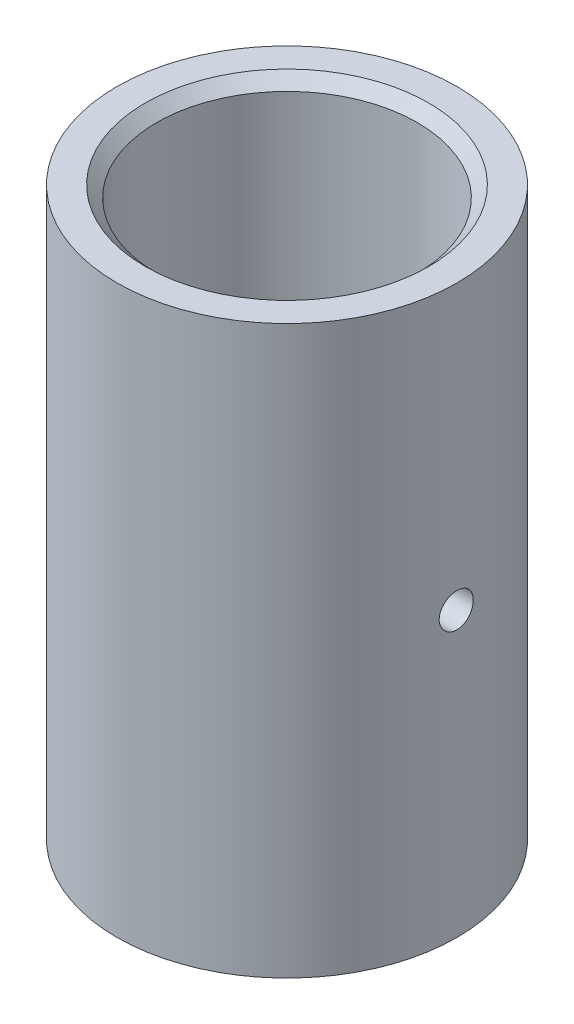
ISO-10303-21;
HEADER;
FILE_DESCRIPTION(('STEP AP214'),'2;1');
FILE_NAME('part.step','',(''),(''),'','','');
FILE_SCHEMA(('AUTOMOTIVE_DESIGN { 1 0 10303 214 1 1 1 1 }'));
ENDSEC;
DATA;
#1=APPLICATION_CONTEXT('core data for automotive mechanical design processes');
#2=APPLICATION_PROTOCOL_DEFINITION('international standard','automotive_design',2000,#1);
#3=PRODUCT_CONTEXT('',#1,'mechanical');
#4=PRODUCT('Part','Part','',(#3));
#5=PRODUCT_RELATED_PRODUCT_CATEGORY('part','',(#4));
#6=PRODUCT_DEFINITION_FORMATION('','',#4);
#7=PRODUCT_DEFINITION_CONTEXT('part definition',#1,'design');
#8=PRODUCT_DEFINITION('design','',#6,#7);
#9=PRODUCT_DEFINITION_SHAPE('','',#8);
#10=(LENGTH_UNIT() NAMED_UNIT(*) SI_UNIT(.MILLI.,.METRE.));
#11=(NAMED_UNIT(*) PLANE_ANGLE_UNIT() SI_UNIT($,.RADIAN.));
#12=(NAMED_UNIT(*) SI_UNIT($,.STERADIAN.) SOLID_ANGLE_UNIT());
#13=UNCERTAINTY_MEASURE_WITH_UNIT(LENGTH_MEASURE(1.E-05),#10,'distance_accuracy_value','');
#14=(GEOMETRIC_REPRESENTATION_CONTEXT(3) GLOBAL_UNCERTAINTY_ASSIGNED_CONTEXT((#13)) GLOBAL_UNIT_ASSIGNED_CONTEXT((#10,
#11,#12)) REPRESENTATION_CONTEXT('',''));
#15=CARTESIAN_POINT('',(0.,0.,0.));
#16=DIRECTION('',(0.,0.,1.));
#17=DIRECTION('',(1.,0.,0.));
#18=AXIS2_PLACEMENT_3D('',#15,#16,#17);
#19=CARTESIAN_POINT('',(0.,25.,0.));
#20=DIRECTION('',(0.,-1.,0.));
#21=DIRECTION('',(0.,0.,-1.));
#22=AXIS2_PLACEMENT_3D('',#19,#20,#21);
#23=CYLINDRICAL_SURFACE('',#22,7.5);
#24=CARTESIAN_POINT('',(-7.46240577829965,12.5,-0.75));
#25=CARTESIAN_POINT('',(-7.46240627097677,12.4579853268698,-0.749998180045134));
#26=CARTESIAN_POINT('',(-7.46276442745664,12.4159428736911,-0.746457644236857));
#27=CARTESIAN_POINT('',(-7.46415815668589,12.3330236102798,-0.732387236072671));
#28=CARTESIAN_POINT('',(-7.46519447595914,12.2921481364719,-0.721849661164827));
#29=CARTESIAN_POINT('',(-7.4678259978554,12.2127756355866,-0.694095087051695));
#30=CARTESIAN_POINT('',(-7.46942086160092,12.1742771829564,-0.676882137220424));
#31=CARTESIAN_POINT('',(-7.47298935428865,12.1007241557812,-0.636273200543326));
#32=CARTESIAN_POINT('',(-7.47496290798247,12.0656688991372,-0.612878441719444));
#33=CARTESIAN_POINT('',(-7.47907445032424,11.9998615522569,-0.560478571499028));
#34=CARTESIAN_POINT('',(-7.4812129500395,11.9691237428722,-0.531455563581194));
#35=CARTESIAN_POINT('',(-7.48540878926789,11.9129467932473,-0.468661286489673));
#36=CARTESIAN_POINT('',(-7.4874661250641,11.8875078954453,-0.434889800179926));
#37=CARTESIAN_POINT('',(-7.49127287366704,11.8426015572446,-0.363469771238241));
#38=CARTESIAN_POINT('',(-7.49302163170985,11.8231467509048,-0.325813246897177));
#39=CARTESIAN_POINT('',(-7.49600862656828,11.7908416751385,-0.247747488215632));
#40=CARTESIAN_POINT('',(-7.49724687582798,11.7779912447229,-0.207338321001163));
#41=CARTESIAN_POINT('',(-7.49906974928269,11.7593015679851,-0.125058587057212));
#42=CARTESIAN_POINT('',(-7.49965655882113,11.7534388754375,-0.0831933952736856));
#43=CARTESIAN_POINT('',(-7.50011786699019,11.7488185481497,0.000930555516707348));
#44=CARTESIAN_POINT('',(-7.49999238408954,11.7500607291903,0.0431893042908458));
#45=CARTESIAN_POINT('',(-7.49904503483389,11.7595958544876,0.12674163304842));
#46=CARTESIAN_POINT('',(-7.49822565863784,11.7678635866729,0.168038122451234));
#47=CARTESIAN_POINT('',(-7.49598546948698,11.79117584671,0.2486543846284));
#48=CARTESIAN_POINT('',(-7.49456464871965,11.8062204625907,0.287974131718296));
#49=CARTESIAN_POINT('',(-7.49127703112937,11.8426870724408,0.36360023600969));
#50=CARTESIAN_POINT('',(-7.48940945524318,11.8641202231476,0.399901178236238));
#51=CARTESIAN_POINT('',(-7.48543788389556,11.9127473925023,0.468400134880646));
#52=CARTESIAN_POINT('',(-7.48333388150108,11.9399415801089,0.500598028920621));
#53=CARTESIAN_POINT('',(-7.47911470100888,11.9994606721352,0.560124578867017));
#54=CARTESIAN_POINT('',(-7.47699951429771,12.0318075085562,0.587431309642758));
#55=CARTESIAN_POINT('',(-7.47300554946167,12.1006376489081,0.636230651518438));
#56=CARTESIAN_POINT('',(-7.47112677167973,12.1371209588391,0.657723254184667));
#57=CARTESIAN_POINT('',(-7.46781817135612,12.2132052688998,0.694284138429923));
#58=CARTESIAN_POINT('',(-7.46638844349416,12.2528069243172,0.70935106542972));
#59=CARTESIAN_POINT('',(-7.46414176403203,12.333995453461,0.732615551728192));
#60=CARTESIAN_POINT('',(-7.46332479376326,12.3755822666656,0.740813320307275));
#61=CARTESIAN_POINT('',(-7.46239935395563,12.4593681346471,0.75007858154397));
#62=CARTESIAN_POINT('',(-7.46228783660702,12.5015637651986,0.751176747485409));
#63=CARTESIAN_POINT('',(-7.46277788516079,12.5855384493671,0.746292185153522));
#64=CARTESIAN_POINT('',(-7.46337944142796,12.6273175086053,0.740309552557316));
#65=CARTESIAN_POINT('',(-7.46522508316801,12.7091836867088,0.72145888088064));
#66=CARTESIAN_POINT('',(-7.46646781501009,12.749274178321,0.708605345391682));
#67=CARTESIAN_POINT('',(-7.46945468279096,12.8267300387977,0.676392539756955));
#68=CARTESIAN_POINT('',(-7.47119883021502,12.8640953452154,0.657033120587692));
#69=CARTESIAN_POINT('',(-7.47499938266785,12.9351799805216,0.612281251067414));
#70=CARTESIAN_POINT('',(-7.47705683111004,12.9688864564747,0.586868474880519));
#71=CARTESIAN_POINT('',(-7.4812487446889,13.0315662899556,0.530760400088381));
#72=CARTESIAN_POINT('',(-7.48338321173149,13.0605395302551,0.500064970686101));
#73=CARTESIAN_POINT('',(-7.48749785886976,13.1130362250486,0.434129853169856));
#74=CARTESIAN_POINT('',(-7.48947745541606,13.1365396696897,0.39887419197709));
#75=CARTESIAN_POINT('',(-7.49305081579973,13.1772919013798,0.324898288062849));
#76=CARTESIAN_POINT('',(-7.49464458492369,13.1945407741303,0.28617809282222));
#77=CARTESIAN_POINT('',(-7.49726407810504,13.2222603257415,0.206442094824612));
#78=CARTESIAN_POINT('',(-7.49829081454236,13.2327430904939,0.16543052823747));
#79=CARTESIAN_POINT('',(-7.49966470960237,13.2466723021849,0.0822186104877594));
#80=CARTESIAN_POINT('',(-7.50001188732422,13.2501189468755,0.0400182927691633));
#81=CARTESIAN_POINT('',(-7.49998753734952,13.24987530017,-0.0441766680568097));
#82=CARTESIAN_POINT('',(-7.49961913782502,13.2462160723725,-0.0861714054183956));
#83=CARTESIAN_POINT('',(-7.49821120183193,13.2319296907573,-0.168946416267272));
#84=CARTESIAN_POINT('',(-7.49717166483655,13.2213025314703,-0.209726688801274));
#85=CARTESIAN_POINT('',(-7.49453792860471,13.1933905569553,-0.288914931575808));
#86=CARTESIAN_POINT('',(-7.49294380502437,13.1761066497994,-0.327323224558146));
#87=CARTESIAN_POINT('',(-7.48937859312222,13.1353751233123,-0.400698450116097));
#88=CARTESIAN_POINT('',(-7.48740750700616,13.1119275400467,-0.435665402826419));
#89=CARTESIAN_POINT('',(-7.48329888501791,13.0594177857322,-0.501324543320204));
#90=CARTESIAN_POINT('',(-7.48116068595524,13.0303324878164,-0.531998194664506));
#91=CARTESIAN_POINT('',(-7.47696443077244,12.9674184863409,-0.588043319544858));
#92=CARTESIAN_POINT('',(-7.47490639400833,12.9335886461232,-0.613413518885886));
#93=CARTESIAN_POINT('',(-7.47109787557951,12.8620517435601,-0.65818248031804));
#94=CARTESIAN_POINT('',(-7.4693481894398,12.824335039007,-0.677565890996126));
#95=CARTESIAN_POINT('',(-7.46636396071846,12.7461887815653,-0.709698531074077));
#96=CARTESIAN_POINT('',(-7.46512883740019,12.7057623470557,-0.722455243417394));
#97=CARTESIAN_POINT('',(-7.46362505653609,12.6375891943257,-0.737791266250147));
#98=CARTESIAN_POINT('',(-7.4631699895177,12.6102783115202,-0.742363284298669));
#99=CARTESIAN_POINT('',(-7.46256018883247,12.5553156327181,-0.748468243953835));
#100=CARTESIAN_POINT('',(-7.46240545390488,12.5276638381531,-0.750001198317948));
#101=CARTESIAN_POINT('',(-7.46240577829965,12.5,-0.75));
#102=B_SPLINE_CURVE_WITH_KNOTS('',3,(#24,#25,#26,#27,#28,#29,#30,#31,#32,#33,#34,#35,#36,#37,
#38,#39,#40,#41,#42,#43,#44,#45,#46,#47,#48,#49,#50,#51,#52,#53,#54,#55,#56,#57,#58,#59,#60,#61,
#62,#63,#64,#65,#66,#67,#68,#69,#70,#71,#72,#73,#74,#75,#76,#77,#78,#79,#80,#81,#82,#83,#84,#85,
#86,#87,#88,#89,#90,#91,#92,#93,#94,#95,#96,#97,#98,#99,#100,#101),.UNSPECIFIED.,.T.,.F.,(4,2,2,
2,2,2,2,2,2,2,2,2,2,2,2,2,2,2,2,2,2,2,2,2,2,2,2,2,2,2,2,2,2,2,2,2,2,2,4),(0.,0.125942995827347,
0.252024863866327,0.378030368248105,0.504010860315985,0.630398711474438,0.756792343914397,
0.883451024784688,1.01010661805846,1.13633603173837,1.26256217248674,1.38833723863996,
1.51411393860731,1.6401115909981,1.76611293913897,1.89266568813751,2.01921862070672,
2.1457982183845,2.27237395946275,2.39840247230824,2.52442928225153,2.65019111028395,
2.77595581920785,2.90214892358789,3.02834515292402,3.15499602613589,3.28164516388504,
3.40806744520771,3.53448617334862,3.66035350101362,3.78622092747494,3.91207118996435,
4.03792071608099,4.16429786278491,4.29070533775894,4.41743430802857,4.54401986170501,
4.62694520704535,4.70987020427861),.UNSPECIFIED.);
#103=CARTESIAN_POINT('',(-7.46240577829965,12.5,-0.75));
#104=VERTEX_POINT('',#103);
#105=EDGE_CURVE('E106',#104,#104,#102,.T.);
#106=ORIENTED_EDGE('',*,*,#105,.F.);
#107=EDGE_LOOP('',(#106));
#108=FACE_BOUND('',#107,.T.);
#109=CARTESIAN_POINT('',(0.,0.,0.));
#110=DIRECTION('',(0.,1.,0.));
#111=DIRECTION('',(0.,0.,1.));
#112=AXIS2_PLACEMENT_3D('',#109,#110,#111);
#113=CIRCLE('',#112,7.5);
#114=CARTESIAN_POINT('',(0.,0.,7.5));
#115=VERTEX_POINT('',#114);
#116=EDGE_CURVE('E59',#115,#115,#113,.T.);
#117=ORIENTED_EDGE('',*,*,#116,.T.);
#118=EDGE_LOOP('',(#117));
#119=FACE_BOUND('',#118,.T.);
#120=CARTESIAN_POINT('',(0.,25.,0.));
#121=DIRECTION('',(0.,1.,0.));
#122=DIRECTION('',(0.,0.,1.));
#123=AXIS2_PLACEMENT_3D('',#120,#121,#122);
#124=CIRCLE('',#123,7.5);
#125=CARTESIAN_POINT('',(0.,25.,7.5));
#126=VERTEX_POINT('',#125);
#127=EDGE_CURVE('E55',#126,#126,#124,.T.);
#128=ORIENTED_EDGE('',*,*,#127,.F.);
#129=EDGE_LOOP('',(#128));
#130=FACE_BOUND('',#129,.T.);
#131=CARTESIAN_POINT('',(7.46240577829965,12.5,0.75));
#132=CARTESIAN_POINT('',(7.46240627097677,12.5420146731302,0.749998180045134));
#133=CARTESIAN_POINT('',(7.46276442745664,12.5840571263089,0.746457644236856));
#134=CARTESIAN_POINT('',(7.46415815668589,12.6669763897202,0.732387236072671));
#135=CARTESIAN_POINT('',(7.46519447595914,12.7078518635281,0.721849661164827));
#136=CARTESIAN_POINT('',(7.4678259978554,12.7872243644134,0.694095087051695));
#137=CARTESIAN_POINT('',(7.46942086160092,12.8257228170436,0.676882137220424));
#138=CARTESIAN_POINT('',(7.47298935428865,12.8992758442188,0.636273200543326));
#139=CARTESIAN_POINT('',(7.47496290798247,12.9343311008628,0.612878441719444));
#140=CARTESIAN_POINT('',(7.47907445032424,13.0001384477431,0.560478571499028));
#141=CARTESIAN_POINT('',(7.4812129500395,13.0308762571278,0.531455563581194));
#142=CARTESIAN_POINT('',(7.48540878926789,13.0870532067527,0.468661286489673));
#143=CARTESIAN_POINT('',(7.4874661250641,13.1124921045547,0.434889800179927));
#144=CARTESIAN_POINT('',(7.49127287366704,13.1573984427554,0.363469771238241));
#145=CARTESIAN_POINT('',(7.49302163170985,13.1768532490952,0.325813246897177));
#146=CARTESIAN_POINT('',(7.49600862656828,13.2091583248615,0.247747488215633));
#147=CARTESIAN_POINT('',(7.49724687582798,13.2220087552771,0.207338321001164));
#148=CARTESIAN_POINT('',(7.49906974928269,13.2406984320149,0.125058587057212));
#149=CARTESIAN_POINT('',(7.49965655882113,13.2465611245625,0.0831933952736857));
#150=CARTESIAN_POINT('',(7.50011786699019,13.2511814518503,-0.000930555516707375));
#151=CARTESIAN_POINT('',(7.49999238408954,13.2499392708097,-0.0431893042908458));
#152=CARTESIAN_POINT('',(7.49904503483389,13.2404041455124,-0.12674163304842));
#153=CARTESIAN_POINT('',(7.49822565863784,13.2321364133271,-0.168038122451234));
#154=CARTESIAN_POINT('',(7.49598546948698,13.20882415329,-0.2486543846284));
#155=CARTESIAN_POINT('',(7.49456464871965,13.1937795374093,-0.287974131718296));
#156=CARTESIAN_POINT('',(7.49127703112937,13.1573129275592,-0.36360023600969));
#157=CARTESIAN_POINT('',(7.48940945524318,13.1358797768524,-0.399901178236238));
#158=CARTESIAN_POINT('',(7.48543788389556,13.0872526074977,-0.468400134880646));
#159=CARTESIAN_POINT('',(7.48333388150108,13.0600584198911,-0.500598028920621));
#160=CARTESIAN_POINT('',(7.47911470100888,13.0005393278648,-0.560124578867017));
#161=CARTESIAN_POINT('',(7.47699951429771,12.9681924914438,-0.587431309642758));
#162=CARTESIAN_POINT('',(7.47300554946167,12.8993623510919,-0.636230651518438));
#163=CARTESIAN_POINT('',(7.47112677167973,12.8628790411609,-0.657723254184667));
#164=CARTESIAN_POINT('',(7.46781817135612,12.7867947311002,-0.694284138429923));
#165=CARTESIAN_POINT('',(7.46638844349416,12.7471930756828,-0.70935106542972));
#166=CARTESIAN_POINT('',(7.46414176403203,12.666004546539,-0.732615551728192));
#167=CARTESIAN_POINT('',(7.46332479376326,12.6244177333344,-0.740813320307275));
#168=CARTESIAN_POINT('',(7.46239935395563,12.5406318653529,-0.75007858154397));
#169=CARTESIAN_POINT('',(7.46228783660702,12.4984362348014,-0.751176747485409));
#170=CARTESIAN_POINT('',(7.46277788516079,12.4144615506329,-0.746292185153522));
#171=CARTESIAN_POINT('',(7.46337944142796,12.3726824913947,-0.740309552557316));
#172=CARTESIAN_POINT('',(7.46522508316801,12.2908163132912,-0.72145888088064));
#173=CARTESIAN_POINT('',(7.46646781501009,12.250725821679,-0.708605345391682));
#174=CARTESIAN_POINT('',(7.46945468279096,12.1732699612023,-0.676392539756955));
#175=CARTESIAN_POINT('',(7.47119883021502,12.1359046547846,-0.657033120587692));
#176=CARTESIAN_POINT('',(7.47499938266785,12.0648200194784,-0.612281251067414));
#177=CARTESIAN_POINT('',(7.47705683111004,12.0311135435253,-0.586868474880519));
#178=CARTESIAN_POINT('',(7.4812487446889,11.9684337100445,-0.530760400088381));
#179=CARTESIAN_POINT('',(7.48338321173149,11.9394604697449,-0.500064970686101));
#180=CARTESIAN_POINT('',(7.48749785886976,11.8869637749514,-0.434129853169856));
#181=CARTESIAN_POINT('',(7.48947745541606,11.8634603303103,-0.39887419197709));
#182=CARTESIAN_POINT('',(7.49305081579973,11.8227080986202,-0.32489828806285));
#183=CARTESIAN_POINT('',(7.49464458492369,11.8054592258697,-0.28617809282222));
#184=CARTESIAN_POINT('',(7.49726407810504,11.7777396742585,-0.206442094824612));
#185=CARTESIAN_POINT('',(7.49829081454236,11.7672569095061,-0.16543052823747));
#186=CARTESIAN_POINT('',(7.49966470960237,11.7533276978151,-0.0822186104877594));
#187=CARTESIAN_POINT('',(7.50001188732422,11.7498810531245,-0.0400182927691633));
#188=CARTESIAN_POINT('',(7.49998753734952,11.75012469983,0.0441766680568097));
#189=CARTESIAN_POINT('',(7.49961913782502,11.7537839276275,0.0861714054183956));
#190=CARTESIAN_POINT('',(7.49821120183193,11.7680703092427,0.168946416267272));
#191=CARTESIAN_POINT('',(7.49717166483655,11.7786974685297,0.209726688801274));
#192=CARTESIAN_POINT('',(7.49453792860471,11.8066094430447,0.288914931575808));
#193=CARTESIAN_POINT('',(7.49294380502437,11.8238933502006,0.327323224558146));
#194=CARTESIAN_POINT('',(7.48937859312222,11.8646248766877,0.400698450116097));
#195=CARTESIAN_POINT('',(7.48740750700616,11.8880724599533,0.435665402826419));
#196=CARTESIAN_POINT('',(7.48329888501791,11.9405822142678,0.501324543320204));
#197=CARTESIAN_POINT('',(7.48116068595524,11.9696675121836,0.531998194664506));
#198=CARTESIAN_POINT('',(7.47696443077244,12.0325815136591,0.588043319544858));
#199=CARTESIAN_POINT('',(7.47490639400833,12.0664113538768,0.613413518885886));
#200=CARTESIAN_POINT('',(7.47109787557951,12.1379482564399,0.65818248031804));
#201=CARTESIAN_POINT('',(7.4693481894398,12.175664960993,0.677565890996126));
#202=CARTESIAN_POINT('',(7.46636396071846,12.2538112184347,0.709698531074077));
#203=CARTESIAN_POINT('',(7.46512883740019,12.2942376529443,0.722455243417394));
#204=CARTESIAN_POINT('',(7.46362505653609,12.3624108056743,0.737791266250147));
#205=CARTESIAN_POINT('',(7.4631699895177,12.3897216884798,0.742363284298669));
#206=CARTESIAN_POINT('',(7.46256018883247,12.4446843672819,0.748468243953835));
#207=CARTESIAN_POINT('',(7.46240545390488,12.4723361618469,0.750001198317948));
#208=CARTESIAN_POINT('',(7.46240577829965,12.5,0.75));
#209=B_SPLINE_CURVE_WITH_KNOTS('',3,(#131,#132,#133,#134,#135,#136,#137,#138,#139,#140,#141,
#142,#143,#144,#145,#146,#147,#148,#149,#150,#151,#152,#153,#154,#155,#156,#157,#158,#159,#160,
#161,#162,#163,#164,#165,#166,#167,#168,#169,#170,#171,#172,#173,#174,#175,#176,#177,#178,#179,
#180,#181,#182,#183,#184,#185,#186,#187,#188,#189,#190,#191,#192,#193,#194,#195,#196,#197,#198,
#199,#200,#201,#202,#203,#204,#205,#206,#207,#208),.UNSPECIFIED.,.T.,.F.,(4,2,2,2,2,2,2,2,2,2,2,
2,2,2,2,2,2,2,2,2,2,2,2,2,2,2,2,2,2,2,2,2,2,2,2,2,2,2,4),(0.,0.125942995827346,
0.252024863866327,0.378030368248104,0.504010860315985,0.630398711474438,0.756792343914397,
0.883451024784687,1.01010661805846,1.13633603173837,1.26256217248674,1.38833723863996,
1.51411393860731,1.6401115909981,1.76611293913897,1.89266568813751,2.01921862070672,
2.1457982183845,2.27237395946275,2.39840247230824,2.52442928225153,2.65019111028395,
2.77595581920785,2.90214892358789,3.02834515292402,3.15499602613589,3.28164516388504,
3.40806744520771,3.53448617334862,3.66035350101362,3.78622092747494,3.91207118996435,
4.03792071608099,4.16429786278491,4.29070533775894,4.41743430802857,4.54401986170501,
4.62694520704535,4.70987020427861),.UNSPECIFIED.);
#210=CARTESIAN_POINT('',(7.46240577829965,12.5,0.75));
#211=VERTEX_POINT('',#210);
#212=EDGE_CURVE('E71',#211,#211,#209,.T.);
#213=ORIENTED_EDGE('',*,*,#212,.T.);
#214=EDGE_LOOP('',(#213));
#215=FACE_BOUND('',#214,.T.);
#216=ADVANCED_FACE('F44',(#108,#119,#130,#215),#23,.T.);
#217=CARTESIAN_POINT('',(0.,4.,0.));
#218=DIRECTION('',(0.,1.,0.));
#219=DIRECTION('',(0.,0.,1.));
#220=AXIS2_PLACEMENT_3D('',#217,#218,#219);
#221=CYLINDRICAL_SURFACE('',#220,3.5);
#222=CARTESIAN_POINT('',(-3.41869858279434,12.5,-0.75));
#223=CARTESIAN_POINT('',(-3.41869942294351,12.5416055762336,-0.749998541194088));
#224=CARTESIAN_POINT('',(-3.41946636233665,12.5832288869482,-0.746526181228762));
#225=CARTESIAN_POINT('',(-3.42244589278789,12.6652933360997,-0.732742796269729));
#226=CARTESIAN_POINT('',(-3.42465955623036,12.7057335743339,-0.722426698268708));
#227=CARTESIAN_POINT('',(-3.43027057629631,12.7842328747946,-0.695294318421272));
#228=CARTESIAN_POINT('',(-3.43366666358336,12.8222944390627,-0.67848500495611));
#229=CARTESIAN_POINT('',(-3.44125835428899,12.8950576369703,-0.638863088367167));
#230=CARTESIAN_POINT('',(-3.44545393440007,12.929759368514,-0.616050660244004));
#231=CARTESIAN_POINT('',(-3.45424789397074,12.9953814807416,-0.564675712850978));
#232=CARTESIAN_POINT('',(-3.45885124935541,13.0262394381201,-0.536034297419881));
#233=CARTESIAN_POINT('',(-3.46789845855534,13.0827517772027,-0.473984754064823));
#234=CARTESIAN_POINT('',(-3.47234230025799,13.10840576443,-0.440576265108847));
#235=CARTESIAN_POINT('',(-3.48062384554625,13.1540277222458,-0.369523644232282));
#236=CARTESIAN_POINT('',(-3.4844549940969,13.1739358278853,-0.331840244114974));
#237=CARTESIAN_POINT('',(-3.49102335521491,13.2071138457231,-0.253567134671299));
#238=CARTESIAN_POINT('',(-3.49376068551671,13.2203844723931,-0.212977738690156));
#239=CARTESIAN_POINT('',(-3.49779782640584,13.2397149854657,-0.130693593835755));
#240=CARTESIAN_POINT('',(-3.49911866689191,13.2458804642762,-0.0890247002984609));
#241=CARTESIAN_POINT('',(-3.50024681103503,13.2511556386566,-0.00522447265332215));
#242=CARTESIAN_POINT('',(-3.5000542811635,13.2502661102804,0.0369068100823797));
#243=CARTESIAN_POINT('',(-3.49819350431279,13.2415355176682,0.119708514625256));
#244=CARTESIAN_POINT('',(-3.49654941576216,13.233808249855,0.160391557681056));
#245=CARTESIAN_POINT('',(-3.49199770794552,13.2118026590741,0.239869731989194));
#246=CARTESIAN_POINT('',(-3.48909003308259,13.1975240478501,0.278664780087526));
#247=CARTESIAN_POINT('',(-3.48229877323429,13.1627192705557,0.353583748778276));
#248=CARTESIAN_POINT('',(-3.47840842901973,13.1421496163978,0.389686828507895));
#249=CARTESIAN_POINT('',(-3.47007896871933,13.0953790159182,0.457970463281424));
#250=CARTESIAN_POINT('',(-3.46563978072347,13.0691773313499,0.490150503225764));
#251=CARTESIAN_POINT('',(-3.45659663230462,13.0112657277361,0.55035104400099));
#252=CARTESIAN_POINT('',(-3.45199115186426,12.9794562103215,0.578275586601253));
#253=CARTESIAN_POINT('',(-3.44321783415987,12.9115583574657,0.62841121617364));
#254=CARTESIAN_POINT('',(-3.43905000781693,12.8754699152974,0.650622160590341));
#255=CARTESIAN_POINT('',(-3.43162011793361,12.7998877494681,0.688740387866483));
#256=CARTESIAN_POINT('',(-3.42836057563888,12.7603849380738,0.704630175444614));
#257=CARTESIAN_POINT('',(-3.42315170403308,12.6791836170268,0.729517475795578));
#258=CARTESIAN_POINT('',(-3.42120217609241,12.6374854412784,0.738516033473139));
#259=CARTESIAN_POINT('',(-3.41887440627723,12.5539521236751,0.74921793012326));
#260=CARTESIAN_POINT('',(-3.41846613525851,12.5121356624613,0.751060709643201));
#261=CARTESIAN_POINT('',(-3.41918619786997,12.4287930034092,0.747775698211867));
#262=CARTESIAN_POINT('',(-3.42031443050531,12.3872667866732,0.742648365408176));
#263=CARTESIAN_POINT('',(-3.42395207742103,12.3061647825096,0.725689473177921));
#264=CARTESIAN_POINT('',(-3.42644577637182,12.2665722837015,0.713934151257768));
#265=CARTESIAN_POINT('',(-3.43251929934889,12.1899188312335,0.684135264733748));
#266=CARTESIAN_POINT('',(-3.43609922386425,12.1528581121829,0.666091118314091));
#267=CARTESIAN_POINT('',(-3.44400817040173,12.0817151576205,0.623917522083524));
#268=CARTESIAN_POINT('',(-3.44834750873158,12.0476852089939,0.59970184295396));
#269=CARTESIAN_POINT('',(-3.4572588768007,11.9841208270631,0.545985919168002));
#270=CARTESIAN_POINT('',(-3.46183093417231,11.9545869292758,0.516485045910805));
#271=CARTESIAN_POINT('',(-3.47079119995087,11.9003148485276,0.452406382210407));
#272=CARTESIAN_POINT('',(-3.47517467803873,11.8756715419215,0.417747462914385));
#273=CARTESIAN_POINT('',(-3.48317805357451,11.8325572953245,0.344700740641138));
#274=CARTESIAN_POINT('',(-3.48679798588346,11.8140860735136,0.30631310802187));
#275=CARTESIAN_POINT('',(-3.49284639190787,11.7839739726808,0.22713270949102));
#276=CARTESIAN_POINT('',(-3.49528221901849,11.7722908481269,0.186356596537586));
#277=CARTESIAN_POINT('',(-3.4987196965099,11.7559541471338,0.103362588501645));
#278=CARTESIAN_POINT('',(-3.49972154656148,11.751299592013,0.0611448949869967));
#279=CARTESIAN_POINT('',(-3.50017255504528,11.7491946737941,-0.0226318585264144));
#280=CARTESIAN_POINT('',(-3.49965229500834,11.7516024206977,-0.0641872527546144));
#281=CARTESIAN_POINT('',(-3.49718276181691,11.7632373817595,-0.14628646920798));
#282=CARTESIAN_POINT('',(-3.49523351236842,11.7724644827892,-0.186830308202642));
#283=CARTESIAN_POINT('',(-3.49012694319269,11.7974094031247,-0.265650974243634));
#284=CARTESIAN_POINT('',(-3.48697323215248,11.8131078446928,-0.303934182536588));
#285=CARTESIAN_POINT('',(-3.47979518025329,11.8505306355846,-0.377342478361609));
#286=CARTESIAN_POINT('',(-3.47577075860164,11.872255544153,-0.41246727239807));
#287=CARTESIAN_POINT('',(-3.46719904967253,11.9215811593713,-0.479256153447622));
#288=CARTESIAN_POINT('',(-3.4626435445396,11.9492820791606,-0.510845182552889));
#289=CARTESIAN_POINT('',(-3.45356845037895,12.0095703051252,-0.568975007288211));
#290=CARTESIAN_POINT('',(-3.44904887022754,12.0421587816778,-0.595514590312102));
#291=CARTESIAN_POINT('',(-3.44049346826046,12.1117952465928,-0.643116307983381));
#292=CARTESIAN_POINT('',(-3.43646452978599,12.1488946791434,-0.664104489048105));
#293=CARTESIAN_POINT('',(-3.42943248613692,12.2261718604617,-0.699515023299101));
#294=CARTESIAN_POINT('',(-3.42642849789546,12.2663469226268,-0.713943032119568));
#295=CARTESIAN_POINT('',(-3.42235280321944,12.3388130655927,-0.733193035607852));
#296=CARTESIAN_POINT('',(-3.42099141547116,12.3707058378531,-0.739483762538932));
#297=CARTESIAN_POINT('',(-3.41916399749064,12.4350621557894,-0.74788772021697));
#298=CARTESIAN_POINT('',(-3.41869792703424,12.467525675757,-0.750001138639108));
#299=CARTESIAN_POINT('',(-3.41869858279434,12.5,-0.75));
#300=B_SPLINE_CURVE_WITH_KNOTS('',3,(#222,#223,#224,#225,#226,#227,#228,#229,#230,#231,#232,
#233,#234,#235,#236,#237,#238,#239,#240,#241,#242,#243,#244,#245,#246,#247,#248,#249,#250,#251,
#252,#253,#254,#255,#256,#257,#258,#259,#260,#261,#262,#263,#264,#265,#266,#267,#268,#269,#270,
#271,#272,#273,#274,#275,#276,#277,#278,#279,#280,#281,#282,#283,#284,#285,#286,#287,#288,#289,
#290,#291,#292,#293,#294,#295,#296,#297,#298,#299),.UNSPECIFIED.,.T.,.F.,(4,2,2,2,2,2,2,2,2,2,2,
2,2,2,2,2,2,2,2,2,2,2,2,2,2,2,2,2,2,2,2,2,2,2,2,2,2,2,4),(0.,0.124697741002726,
0.249488019218576,0.374144745554973,0.498797838346235,0.625266147892055,0.751744040542987,
0.879495674079986,1.00723355320993,1.13304754073824,1.2588476888648,1.38259278831545,
1.50634333301651,1.63096944069578,1.75561189434017,1.88274480387507,2.00988088509405,
2.1373664370375,2.26483265474779,2.38980216594121,2.51476346324818,2.63831590372547,
2.76187977779435,2.88727505106019,3.01268524827398,3.14033107339465,3.2679710693563,
3.39480794910047,3.52162716602129,3.64591599819923,3.77020276855409,3.89412004807601,
4.01804883073542,4.14424457078342,4.27047057813476,4.39830190081484,4.52602280803703,
4.62335728058995,4.72068738006871),.UNSPECIFIED.);
#301=CARTESIAN_POINT('',(-3.41869858279434,12.5,-0.75));
#302=VERTEX_POINT('',#301);
#303=EDGE_CURVE('E102',#302,#302,#300,.T.);
#304=ORIENTED_EDGE('',*,*,#303,.F.);
#305=EDGE_LOOP('',(#304));
#306=FACE_BOUND('',#305,.T.);
#307=CARTESIAN_POINT('',(0.,14.,0.));
#308=DIRECTION('',(0.,1.,0.));
#309=DIRECTION('',(0.,0.,1.));
#310=AXIS2_PLACEMENT_3D('',#307,#308,#309);
#311=CIRCLE('',#310,3.5);
#312=CARTESIAN_POINT('',(0.,14.,3.5));
#313=VERTEX_POINT('',#312);
#314=EDGE_CURVE('E68',#313,#313,#311,.T.);
#315=ORIENTED_EDGE('',*,*,#314,.T.);
#316=EDGE_LOOP('',(#315));
#317=FACE_BOUND('',#316,.T.);
#318=CARTESIAN_POINT('',(0.,4.,0.));
#319=DIRECTION('',(0.,1.,0.));
#320=DIRECTION('',(0.,0.,1.));
#321=AXIS2_PLACEMENT_3D('',#318,#319,#320);
#322=CIRCLE('',#321,3.5);
#323=CARTESIAN_POINT('',(0.,4.,3.5));
#324=VERTEX_POINT('',#323);
#325=EDGE_CURVE('E67',#324,#324,#322,.T.);
#326=ORIENTED_EDGE('',*,*,#325,.F.);
#327=EDGE_LOOP('',(#326));
#328=FACE_BOUND('',#327,.T.);
#329=CARTESIAN_POINT('',(3.41869858279434,12.5,0.75));
#330=CARTESIAN_POINT('',(3.41869942294351,12.4583944237664,0.749998541194088));
#331=CARTESIAN_POINT('',(3.41946636233665,12.4167711130518,0.746526181228762));
#332=CARTESIAN_POINT('',(3.42244589278789,12.3347066639003,0.732742796269729));
#333=CARTESIAN_POINT('',(3.42465955623036,12.2942664256661,0.722426698268708));
#334=CARTESIAN_POINT('',(3.43027057629631,12.2157671252054,0.695294318421272));
#335=CARTESIAN_POINT('',(3.43366666358336,12.1777055609373,0.67848500495611));
#336=CARTESIAN_POINT('',(3.44125835428899,12.1049423630297,0.638863088367167));
#337=CARTESIAN_POINT('',(3.44545393440007,12.070240631486,0.616050660244004));
#338=CARTESIAN_POINT('',(3.45424789397074,12.0046185192584,0.564675712850978));
#339=CARTESIAN_POINT('',(3.45885124935541,11.9737605618799,0.536034297419881));
#340=CARTESIAN_POINT('',(3.46789845855534,11.9172482227973,0.473984754064823));
#341=CARTESIAN_POINT('',(3.47234230025799,11.89159423557,0.440576265108847));
#342=CARTESIAN_POINT('',(3.48062384554625,11.8459722777542,0.369523644232282));
#343=CARTESIAN_POINT('',(3.4844549940969,11.8260641721147,0.331840244114974));
#344=CARTESIAN_POINT('',(3.49102335521491,11.7928861542769,0.2535671346713));
#345=CARTESIAN_POINT('',(3.49376068551671,11.7796155276069,0.212977738690156));
#346=CARTESIAN_POINT('',(3.49779782640584,11.7602850145343,0.130693593835754));
#347=CARTESIAN_POINT('',(3.49911866689191,11.7541195357238,0.0890247002984609));
#348=CARTESIAN_POINT('',(3.50024681103503,11.7488443613434,0.00522447265332214));
#349=CARTESIAN_POINT('',(3.5000542811635,11.7497338897196,-0.0369068100823797));
#350=CARTESIAN_POINT('',(3.49819350431279,11.7584644823318,-0.119708514625256));
#351=CARTESIAN_POINT('',(3.49654941576216,11.766191750145,-0.160391557681056));
#352=CARTESIAN_POINT('',(3.49199770794552,11.7881973409259,-0.239869731989194));
#353=CARTESIAN_POINT('',(3.48909003308259,11.8024759521499,-0.278664780087527));
#354=CARTESIAN_POINT('',(3.48229877323429,11.8372807294443,-0.353583748778276));
#355=CARTESIAN_POINT('',(3.47840842901973,11.8578503836022,-0.389686828507894));
#356=CARTESIAN_POINT('',(3.47007896871933,11.9046209840818,-0.457970463281423));
#357=CARTESIAN_POINT('',(3.46563978072347,11.9308226686502,-0.490150503225764));
#358=CARTESIAN_POINT('',(3.45659663230462,11.9887342722639,-0.55035104400099));
#359=CARTESIAN_POINT('',(3.45199115186426,12.0205437896785,-0.578275586601253));
#360=CARTESIAN_POINT('',(3.44321783415987,12.0884416425343,-0.62841121617364));
#361=CARTESIAN_POINT('',(3.43905000781693,12.1245300847026,-0.650622160590341));
#362=CARTESIAN_POINT('',(3.43162011793361,12.2001122505319,-0.688740387866483));
#363=CARTESIAN_POINT('',(3.42836057563888,12.2396150619262,-0.704630175444614));
#364=CARTESIAN_POINT('',(3.42315170403308,12.3208163829732,-0.729517475795578));
#365=CARTESIAN_POINT('',(3.42120217609241,12.3625145587216,-0.738516033473139));
#366=CARTESIAN_POINT('',(3.41887440627723,12.4460478763249,-0.74921793012326));
#367=CARTESIAN_POINT('',(3.41846613525851,12.4878643375387,-0.751060709643201));
#368=CARTESIAN_POINT('',(3.41918619786997,12.5712069965908,-0.747775698211867));
#369=CARTESIAN_POINT('',(3.42031443050531,12.6127332133268,-0.742648365408176));
#370=CARTESIAN_POINT('',(3.42395207742103,12.6938352174904,-0.725689473177921));
#371=CARTESIAN_POINT('',(3.42644577637182,12.7334277162985,-0.713934151257768));
#372=CARTESIAN_POINT('',(3.43251929934888,12.8100811687665,-0.684135264733748));
#373=CARTESIAN_POINT('',(3.43609922386425,12.8471418878171,-0.666091118314091));
#374=CARTESIAN_POINT('',(3.44400817040173,12.9182848423795,-0.623917522083524));
#375=CARTESIAN_POINT('',(3.44834750873158,12.9523147910061,-0.59970184295396));
#376=CARTESIAN_POINT('',(3.4572588768007,13.0158791729369,-0.545985919168002));
#377=CARTESIAN_POINT('',(3.46183093417231,13.0454130707242,-0.516485045910805));
#378=CARTESIAN_POINT('',(3.47079119995087,13.0996851514724,-0.452406382210407));
#379=CARTESIAN_POINT('',(3.47517467803873,13.1243284580785,-0.417747462914385));
#380=CARTESIAN_POINT('',(3.48317805357451,13.1674427046755,-0.344700740641138));
#381=CARTESIAN_POINT('',(3.48679798588346,13.1859139264864,-0.306313108021869));
#382=CARTESIAN_POINT('',(3.49284639190787,13.2160260273192,-0.22713270949102));
#383=CARTESIAN_POINT('',(3.49528221901849,13.2277091518731,-0.186356596537586));
#384=CARTESIAN_POINT('',(3.4987196965099,13.2440458528662,-0.103362588501645));
#385=CARTESIAN_POINT('',(3.49972154656148,13.248700407987,-0.0611448949869965));
#386=CARTESIAN_POINT('',(3.50017255504528,13.2508053262059,0.0226318585264144));
#387=CARTESIAN_POINT('',(3.49965229500834,13.2483975793023,0.0641872527546145));
#388=CARTESIAN_POINT('',(3.49718276181691,13.2367626182405,0.14628646920798));
#389=CARTESIAN_POINT('',(3.49523351236842,13.2275355172108,0.186830308202642));
#390=CARTESIAN_POINT('',(3.49012694319269,13.2025905968753,0.265650974243634));
#391=CARTESIAN_POINT('',(3.48697323215248,13.1868921553072,0.303934182536588));
#392=CARTESIAN_POINT('',(3.47979518025329,13.1494693644154,0.377342478361609));
#393=CARTESIAN_POINT('',(3.47577075860164,13.127744455847,0.41246727239807));
#394=CARTESIAN_POINT('',(3.46719904967253,13.0784188406287,0.479256153447622));
#395=CARTESIAN_POINT('',(3.4626435445396,13.0507179208394,0.510845182552889));
#396=CARTESIAN_POINT('',(3.45356845037895,12.9904296948748,0.568975007288211));
#397=CARTESIAN_POINT('',(3.44904887022754,12.9578412183222,0.595514590312102));
#398=CARTESIAN_POINT('',(3.44049346826046,12.8882047534072,0.64311630798338));
#399=CARTESIAN_POINT('',(3.436464529786,12.8511053208566,0.664104489048104));
#400=CARTESIAN_POINT('',(3.42943248613692,12.7738281395383,0.6995150232991));
#401=CARTESIAN_POINT('',(3.42642849789546,12.7336530773732,0.713943032119567));
#402=CARTESIAN_POINT('',(3.42235280321944,12.6611869344073,0.733193035607852));
#403=CARTESIAN_POINT('',(3.42099141547116,12.6292941621469,0.739483762538932));
#404=CARTESIAN_POINT('',(3.41916399749064,12.5649378442106,0.74788772021697));
#405=CARTESIAN_POINT('',(3.41869792703424,12.532474324243,0.750001138639108));
#406=CARTESIAN_POINT('',(3.41869858279434,12.5,0.75));
#407=B_SPLINE_CURVE_WITH_KNOTS('',3,(#329,#330,#331,#332,#333,#334,#335,#336,#337,#338,#339,
#340,#341,#342,#343,#344,#345,#346,#347,#348,#349,#350,#351,#352,#353,#354,#355,#356,#357,#358,
#359,#360,#361,#362,#363,#364,#365,#366,#367,#368,#369,#370,#371,#372,#373,#374,#375,#376,#377,
#378,#379,#380,#381,#382,#383,#384,#385,#386,#387,#388,#389,#390,#391,#392,#393,#394,#395,#396,
#397,#398,#399,#400,#401,#402,#403,#404,#405,#406),.UNSPECIFIED.,.T.,.F.,(4,2,2,2,2,2,2,2,2,2,2,
2,2,2,2,2,2,2,2,2,2,2,2,2,2,2,2,2,2,2,2,2,2,2,2,2,2,2,4),(0.,0.124697741002726,
0.249488019218576,0.374144745554973,0.498797838346235,0.625266147892055,0.751744040542987,
0.879495674079986,1.00723355320993,1.13304754073824,1.2588476888648,1.38259278831545,
1.50634333301651,1.63096944069578,1.75561189434017,1.88274480387507,2.00988088509405,
2.1373664370375,2.26483265474779,2.38980216594121,2.51476346324818,2.63831590372547,
2.76187977779434,2.88727505106019,3.01268524827398,3.14033107339465,3.2679710693563,
3.39480794910047,3.52162716602129,3.64591599819923,3.77020276855409,3.89412004807601,
4.01804883073542,4.14424457078342,4.27047057813476,4.39830190081484,4.52602280803703,
4.62335728058995,4.72068738006871),.UNSPECIFIED.);
#408=CARTESIAN_POINT('',(3.41869858279434,12.5,0.75));
#409=VERTEX_POINT('',#408);
#410=EDGE_CURVE('E81',#409,#409,#407,.T.);
#411=ORIENTED_EDGE('',*,*,#410,.T.);
#412=EDGE_LOOP('',(#411));
#413=FACE_BOUND('',#412,.T.);
#414=ADVANCED_FACE('F117',(#306,#317,#328,#413),#221,.F.);
#415=CARTESIAN_POINT('',(0.,25.,0.));
#416=DIRECTION('',(0.,1.,0.));
#417=DIRECTION('',(0.,0.,1.));
#418=AXIS2_PLACEMENT_3D('',#415,#416,#417);
#419=PLANE('',#418);
#420=CARTESIAN_POINT('',(0.,25.,0.));
#421=DIRECTION('',(0.,1.,0.));
#422=DIRECTION('',(0.,0.,1.));
#423=AXIS2_PLACEMENT_3D('',#420,#421,#422);
#424=CIRCLE('',#423,6.25000000000001);
#425=CARTESIAN_POINT('',(0.,25.,6.25000000000001));
#426=VERTEX_POINT('',#425);
#427=EDGE_CURVE('E12',#426,#426,#424,.F.);
#428=ORIENTED_EDGE('',*,*,#427,.T.);
#429=EDGE_LOOP('',(#428));
#430=FACE_BOUND('',#429,.T.);
#431=ORIENTED_EDGE('',*,*,#127,.T.);
#432=EDGE_LOOP('',(#431));
#433=FACE_BOUND('',#432,.T.);
#434=ADVANCED_FACE('F120',(#430,#433),#419,.T.);
#435=CARTESIAN_POINT('',(0.,0.,0.));
#436=DIRECTION('',(0.,1.,0.));
#437=DIRECTION('',(0.,0.,1.));
#438=AXIS2_PLACEMENT_3D('',#435,#436,#437);
#439=PLANE('',#438);
#440=ORIENTED_EDGE('',*,*,#116,.F.);
#441=EDGE_LOOP('',(#440));
#442=FACE_BOUND('',#441,.T.);
#443=ADVANCED_FACE('F139',(#442),#439,.F.);
#444=CARTESIAN_POINT('',(0.,14.,0.));
#445=DIRECTION('',(0.,1.,0.));
#446=DIRECTION('',(0.,0.,1.));
#447=AXIS2_PLACEMENT_3D('',#444,#445,#446);
#448=CYLINDRICAL_SURFACE('',#447,5.75);
#449=CARTESIAN_POINT('',(0.,24.5,0.));
#450=DIRECTION('',(0.,1.,0.));
#451=DIRECTION('',(0.,0.,1.));
#452=AXIS2_PLACEMENT_3D('',#449,#450,#451);
#453=CIRCLE('',#452,5.75);
#454=CARTESIAN_POINT('',(0.,24.5,5.75));
#455=VERTEX_POINT('',#454);
#456=EDGE_CURVE('E51',#455,#455,#453,.T.);
#457=ORIENTED_EDGE('',*,*,#456,.T.);
#458=EDGE_LOOP('',(#457));
#459=FACE_BOUND('',#458,.T.);
#460=CARTESIAN_POINT('',(0.,14.,0.));
#461=DIRECTION('',(0.,1.,0.));
#462=DIRECTION('',(0.,0.,1.));
#463=AXIS2_PLACEMENT_3D('',#460,#461,#462);
#464=CIRCLE('',#463,5.75);
#465=CARTESIAN_POINT('',(0.,14.,5.75));
#466=VERTEX_POINT('',#465);
#467=EDGE_CURVE('E63',#466,#466,#464,.T.);
#468=ORIENTED_EDGE('',*,*,#467,.F.);
#469=EDGE_LOOP('',(#468));
#470=FACE_BOUND('',#469,.T.);
#471=ADVANCED_FACE('F142',(#459,#470),#448,.F.);
#472=CARTESIAN_POINT('',(0.,14.,0.));
#473=DIRECTION('',(0.,1.,0.));
#474=DIRECTION('',(0.,0.,1.));
#475=AXIS2_PLACEMENT_3D('',#472,#473,#474);
#476=PLANE('',#475);
#477=ORIENTED_EDGE('',*,*,#314,.F.);
#478=EDGE_LOOP('',(#477));
#479=FACE_BOUND('',#478,.T.);
#480=ORIENTED_EDGE('',*,*,#467,.T.);
#481=EDGE_LOOP('',(#480));
#482=FACE_BOUND('',#481,.T.);
#483=ADVANCED_FACE('F148',(#479,#482),#476,.T.);
#484=CARTESIAN_POINT('',(0.,24.5,0.));
#485=DIRECTION('',(0.,1.,0.));
#486=DIRECTION('',(0.,0.,1.));
#487=AXIS2_PLACEMENT_3D('',#484,#485,#486);
#488=CONICAL_SURFACE('',#487,5.75,0.785398163397457);
#489=ORIENTED_EDGE('',*,*,#427,.F.);
#490=EDGE_LOOP('',(#489));
#491=FACE_BOUND('',#490,.T.);
#492=ORIENTED_EDGE('',*,*,#456,.F.);
#493=EDGE_LOOP('',(#492));
#494=FACE_BOUND('',#493,.T.);
#495=ADVANCED_FACE('F46',(#491,#494),#488,.F.);
#496=CARTESIAN_POINT('',(0.,4.,0.));
#497=DIRECTION('',(0.,1.,0.));
#498=DIRECTION('',(0.,0.,1.));
#499=AXIS2_PLACEMENT_3D('',#496,#497,#498);
#500=PLANE('',#499);
#501=ORIENTED_EDGE('',*,*,#325,.T.);
#502=EDGE_LOOP('',(#501));
#503=FACE_BOUND('',#502,.T.);
#504=ADVANCED_FACE('F130',(#503),#500,.T.);
#505=CARTESIAN_POINT('',(7.501,12.5,0.));
#506=DIRECTION('',(-1.,0.,0.));
#507=DIRECTION('',(0.,0.,1.));
#508=AXIS2_PLACEMENT_3D('',#505,#506,#507);
#509=CYLINDRICAL_SURFACE('',#508,0.75);
#510=ORIENTED_EDGE('',*,*,#410,.F.);
#511=EDGE_LOOP('',(#510));
#512=FACE_BOUND('',#511,.T.);
#513=ORIENTED_EDGE('',*,*,#212,.F.);
#514=EDGE_LOOP('',(#513));
#515=FACE_BOUND('',#514,.T.);
#516=ADVANCED_FACE('F87',(#512,#515),#509,.F.);
#517=CARTESIAN_POINT('',(-7.501,12.5,0.));
#518=DIRECTION('',(1.,0.,0.));
#519=DIRECTION('',(0.,0.,-1.));
#520=AXIS2_PLACEMENT_3D('',#517,#518,#519);
#521=CYLINDRICAL_SURFACE('',#520,0.75);
#522=ORIENTED_EDGE('',*,*,#303,.T.);
#523=EDGE_LOOP('',(#522));
#524=FACE_BOUND('',#523,.T.);
#525=ORIENTED_EDGE('',*,*,#105,.T.);
#526=EDGE_LOOP('',(#525));
#527=FACE_BOUND('',#526,.T.);
#528=ADVANCED_FACE('F93',(#524,#527),#521,.F.);
#529=CLOSED_SHELL('',(#216,#414,#434,#443,#471,#483,#495,#504,#516,#528));
#530=MANIFOLD_SOLID_BREP('B2',#529);
#531=ADVANCED_BREP_SHAPE_REPRESENTATION('',(#18,#530),#14);
#532=SHAPE_DEFINITION_REPRESENTATION(#9,#531);
ENDSEC;
END-ISO-10303-21;
